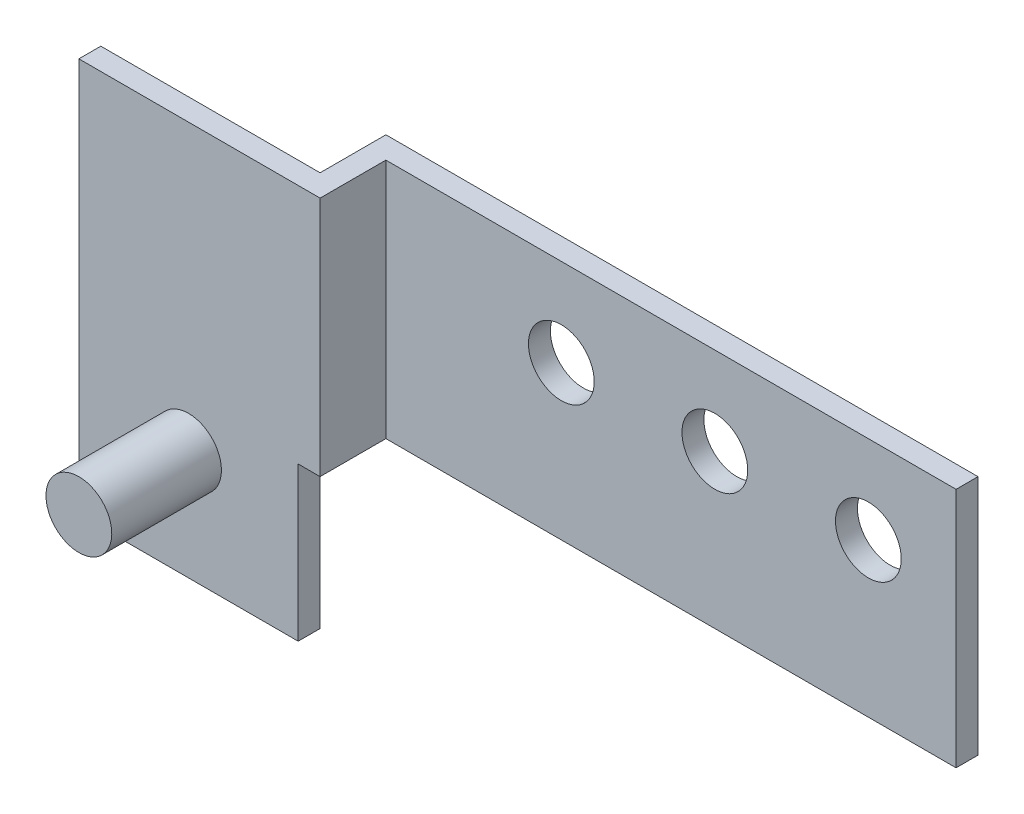
ISO-10303-21;
HEADER;
FILE_DESCRIPTION(('STEP AP214'),'2;1');
FILE_NAME('part.step','',(''),(''),'','','');
FILE_SCHEMA(('AUTOMOTIVE_DESIGN { 1 0 10303 214 1 1 1 1 }'));
ENDSEC;
DATA;
#1=APPLICATION_CONTEXT('core data for automotive mechanical design processes');
#2=APPLICATION_PROTOCOL_DEFINITION('international standard','automotive_design',2000,#1);
#3=PRODUCT_CONTEXT('',#1,'mechanical');
#4=PRODUCT('Part','Part','',(#3));
#5=PRODUCT_RELATED_PRODUCT_CATEGORY('part','',(#4));
#6=PRODUCT_DEFINITION_FORMATION('','',#4);
#7=PRODUCT_DEFINITION_CONTEXT('part definition',#1,'design');
#8=PRODUCT_DEFINITION('design','',#6,#7);
#9=PRODUCT_DEFINITION_SHAPE('','',#8);
#10=(LENGTH_UNIT() NAMED_UNIT(*) SI_UNIT(.MILLI.,.METRE.));
#11=(NAMED_UNIT(*) PLANE_ANGLE_UNIT() SI_UNIT($,.RADIAN.));
#12=(NAMED_UNIT(*) SI_UNIT($,.STERADIAN.) SOLID_ANGLE_UNIT());
#13=UNCERTAINTY_MEASURE_WITH_UNIT(LENGTH_MEASURE(1.E-05),#10,'distance_accuracy_value','');
#14=(GEOMETRIC_REPRESENTATION_CONTEXT(3) GLOBAL_UNCERTAINTY_ASSIGNED_CONTEXT((#13)) GLOBAL_UNIT_ASSIGNED_CONTEXT((#10,
#11,#12)) REPRESENTATION_CONTEXT('',''));
#15=CARTESIAN_POINT('',(0.,0.,0.));
#16=DIRECTION('',(0.,0.,1.));
#17=DIRECTION('',(1.,0.,0.));
#18=AXIS2_PLACEMENT_3D('',#15,#16,#17);
#19=CARTESIAN_POINT('',(0.,0.,3.));
#20=DIRECTION('',(0.,0.,1.));
#21=DIRECTION('',(1.,0.,0.));
#22=AXIS2_PLACEMENT_3D('',#19,#20,#21);
#23=PLANE('',#22);
#24=DIRECTION('',(0.,1.,0.));
#25=VECTOR('',#24,1.);
#26=CARTESIAN_POINT('',(0.,0.,3.));
#27=LINE('',#26,#25);
#28=CARTESIAN_POINT('',(0.,-11.,3.));
#29=VERTEX_POINT('',#28);
#30=CARTESIAN_POINT('',(0.,0.,3.));
#31=VERTEX_POINT('',#30);
#32=EDGE_CURVE('E108',#29,#31,#27,.T.);
#33=ORIENTED_EDGE('',*,*,#32,.F.);
#34=DIRECTION('',(0.,-1.,0.));
#35=VECTOR('',#34,1.);
#36=CARTESIAN_POINT('',(0.,-11.,3.));
#37=LINE('',#36,#35);
#38=CARTESIAN_POINT('',(0.,-18.,3.));
#39=VERTEX_POINT('',#38);
#40=EDGE_CURVE('E124',#29,#39,#37,.T.);
#41=ORIENTED_EDGE('',*,*,#40,.T.);
#42=DIRECTION('',(1.,0.,0.));
#43=VECTOR('',#42,1.);
#44=CARTESIAN_POINT('',(-10.,-18.,3.));
#45=LINE('',#44,#43);
#46=CARTESIAN_POINT('',(-10.,-18.,3.));
#47=VERTEX_POINT('',#46);
#48=EDGE_CURVE('E107',#47,#39,#45,.T.);
#49=ORIENTED_EDGE('',*,*,#48,.F.);
#50=DIRECTION('',(0.,-1.,0.));
#51=VECTOR('',#50,1.);
#52=CARTESIAN_POINT('',(-10.,0.,3.));
#53=LINE('',#52,#51);
#54=CARTESIAN_POINT('',(-10.,0.,3.));
#55=VERTEX_POINT('',#54);
#56=EDGE_CURVE('E81',#55,#47,#53,.T.);
#57=ORIENTED_EDGE('',*,*,#56,.F.);
#58=DIRECTION('',(-1.,0.,0.));
#59=VECTOR('',#58,1.);
#60=CARTESIAN_POINT('',(27.,0.,3.));
#61=LINE('',#60,#59);
#62=EDGE_CURVE('E59',#31,#55,#61,.T.);
#63=ORIENTED_EDGE('',*,*,#62,.F.);
#64=EDGE_LOOP('',(#33,#41,#49,#57,#63));
#65=FACE_BOUND('',#64,.T.);
#66=ADVANCED_FACE('F35',(#65),#23,.F.);
#67=CARTESIAN_POINT('',(-10.,0.,3.));
#68=DIRECTION('',(-1.,0.,0.));
#69=DIRECTION('',(0.,0.,1.));
#70=AXIS2_PLACEMENT_3D('',#67,#68,#69);
#71=PLANE('',#70);
#72=DIRECTION('',(0.,-1.,0.));
#73=VECTOR('',#72,1.);
#74=CARTESIAN_POINT('',(-10.,0.,4.));
#75=LINE('',#74,#73);
#76=CARTESIAN_POINT('',(-10.,0.,4.));
#77=VERTEX_POINT('',#76);
#78=CARTESIAN_POINT('',(-10.,-18.,4.));
#79=VERTEX_POINT('',#78);
#80=EDGE_CURVE('E77',#77,#79,#75,.T.);
#81=ORIENTED_EDGE('',*,*,#80,.F.);
#82=DIRECTION('',(0.,0.,1.));
#83=VECTOR('',#82,1.);
#84=CARTESIAN_POINT('',(-10.,0.,3.));
#85=LINE('',#84,#83);
#86=EDGE_CURVE('E43',#55,#77,#85,.T.);
#87=ORIENTED_EDGE('',*,*,#86,.F.);
#88=ORIENTED_EDGE('',*,*,#56,.T.);
#89=DIRECTION('',(0.,0.,1.));
#90=VECTOR('',#89,1.);
#91=CARTESIAN_POINT('',(-10.,-18.,3.));
#92=LINE('',#91,#90);
#93=EDGE_CURVE('E91',#47,#79,#92,.T.);
#94=ORIENTED_EDGE('',*,*,#93,.T.);
#95=EDGE_LOOP('',(#81,#87,#88,#94));
#96=FACE_BOUND('',#95,.T.);
#97=ADVANCED_FACE('F37',(#96),#71,.T.);
#98=CARTESIAN_POINT('',(27.,0.,3.));
#99=DIRECTION('',(0.,1.,0.));
#100=DIRECTION('',(-1.,0.,0.));
#101=AXIS2_PLACEMENT_3D('',#98,#99,#100);
#102=PLANE('',#101);
#103=DIRECTION('',(-1.,0.,0.));
#104=VECTOR('',#103,1.);
#105=CARTESIAN_POINT('',(27.,0.,1.));
#106=LINE('',#105,#104);
#107=CARTESIAN_POINT('',(27.,0.,1.));
#108=VERTEX_POINT('',#107);
#109=CARTESIAN_POINT('',(0.999999999999999,0.,1.));
#110=VERTEX_POINT('',#109);
#111=EDGE_CURVE('E113',#108,#110,#106,.T.);
#112=ORIENTED_EDGE('',*,*,#111,.F.);
#113=DIRECTION('',(0.,0.,1.));
#114=VECTOR('',#113,1.);
#115=CARTESIAN_POINT('',(27.,0.,3.));
#116=LINE('',#115,#114);
#117=CARTESIAN_POINT('',(27.,0.,0.));
#118=VERTEX_POINT('',#117);
#119=EDGE_CURVE('E89',#118,#108,#116,.T.);
#120=ORIENTED_EDGE('',*,*,#119,.F.);
#121=DIRECTION('',(1.,0.,0.));
#122=VECTOR('',#121,1.);
#123=CARTESIAN_POINT('',(27.,0.,0.));
#124=LINE('',#123,#122);
#125=CARTESIAN_POINT('',(0.,0.,0.));
#126=VERTEX_POINT('',#125);
#127=EDGE_CURVE('E207',#126,#118,#124,.T.);
#128=ORIENTED_EDGE('',*,*,#127,.F.);
#129=DIRECTION('',(0.,0.,1.));
#130=VECTOR('',#129,1.);
#131=CARTESIAN_POINT('',(0.,0.,0.));
#132=LINE('',#131,#130);
#133=EDGE_CURVE('E114',#126,#31,#132,.T.);
#134=ORIENTED_EDGE('',*,*,#133,.T.);
#135=ORIENTED_EDGE('',*,*,#62,.T.);
#136=ORIENTED_EDGE('',*,*,#86,.T.);
#137=DIRECTION('',(-1.,0.,0.));
#138=VECTOR('',#137,1.);
#139=CARTESIAN_POINT('',(27.,0.,4.));
#140=LINE('',#139,#138);
#141=CARTESIAN_POINT('',(0.999999999999998,0.,4.));
#142=VERTEX_POINT('',#141);
#143=EDGE_CURVE('E73',#142,#77,#140,.T.);
#144=ORIENTED_EDGE('',*,*,#143,.F.);
#145=DIRECTION('',(0.,0.,1.));
#146=VECTOR('',#145,1.);
#147=CARTESIAN_POINT('',(0.999999999999997,0.,2.99999999999999));
#148=LINE('',#147,#146);
#149=EDGE_CURVE('E198',#110,#142,#148,.T.);
#150=ORIENTED_EDGE('',*,*,#149,.F.);
#151=EDGE_LOOP('',(#112,#120,#128,#134,#135,#136,#144,#150));
#152=FACE_BOUND('',#151,.T.);
#153=ADVANCED_FACE('F85',(#152),#102,.T.);
#154=CARTESIAN_POINT('',(27.,-18.,3.));
#155=DIRECTION('',(1.,0.,0.));
#156=DIRECTION('',(0.,0.,-1.));
#157=AXIS2_PLACEMENT_3D('',#154,#155,#156);
#158=PLANE('',#157);
#159=DIRECTION('',(0.,-1.,0.));
#160=VECTOR('',#159,1.);
#161=CARTESIAN_POINT('',(27.,5.00000000083767E-05,1.));
#162=LINE('',#161,#160);
#163=CARTESIAN_POINT('',(27.,-11.,1.));
#164=VERTEX_POINT('',#163);
#165=EDGE_CURVE('E195',#108,#164,#162,.T.);
#166=ORIENTED_EDGE('',*,*,#165,.T.);
#167=DIRECTION('',(0.,0.,1.));
#168=VECTOR('',#167,1.);
#169=CARTESIAN_POINT('',(27.,-11.,3.));
#170=LINE('',#169,#168);
#171=CARTESIAN_POINT('',(27.,-11.,0.));
#172=VERTEX_POINT('',#171);
#173=EDGE_CURVE('E127',#172,#164,#170,.T.);
#174=ORIENTED_EDGE('',*,*,#173,.F.);
#175=DIRECTION('',(0.,-1.,0.));
#176=VECTOR('',#175,1.);
#177=CARTESIAN_POINT('',(27.,-11.,0.));
#178=LINE('',#177,#176);
#179=EDGE_CURVE('E118',#118,#172,#178,.T.);
#180=ORIENTED_EDGE('',*,*,#179,.F.);
#181=ORIENTED_EDGE('',*,*,#119,.T.);
#182=EDGE_LOOP('',(#166,#174,#180,#181));
#183=FACE_BOUND('',#182,.T.);
#184=ADVANCED_FACE('F214',(#183),#158,.T.);
#185=CARTESIAN_POINT('',(-10.,-18.,3.));
#186=DIRECTION('',(0.,-1.,0.));
#187=DIRECTION('',(0.,0.,-1.));
#188=AXIS2_PLACEMENT_3D('',#185,#186,#187);
#189=PLANE('',#188);
#190=DIRECTION('',(0.,0.,1.));
#191=VECTOR('',#190,1.);
#192=CARTESIAN_POINT('',(0.,-18.,3.));
#193=LINE('',#192,#191);
#194=CARTESIAN_POINT('',(0.,-18.,4.));
#195=VERTEX_POINT('',#194);
#196=EDGE_CURVE('E93',#39,#195,#193,.T.);
#197=ORIENTED_EDGE('',*,*,#196,.T.);
#198=DIRECTION('',(1.,0.,0.));
#199=VECTOR('',#198,1.);
#200=CARTESIAN_POINT('',(-10.,-18.,4.));
#201=LINE('',#200,#199);
#202=EDGE_CURVE('E82',#79,#195,#201,.T.);
#203=ORIENTED_EDGE('',*,*,#202,.F.);
#204=ORIENTED_EDGE('',*,*,#93,.F.);
#205=ORIENTED_EDGE('',*,*,#48,.T.);
#206=EDGE_LOOP('',(#197,#203,#204,#205));
#207=FACE_BOUND('',#206,.T.);
#208=ADVANCED_FACE('F140',(#207),#189,.T.);
#209=CARTESIAN_POINT('',(0.,0.,4.));
#210=DIRECTION('',(0.,0.,1.));
#211=DIRECTION('',(1.,0.,0.));
#212=AXIS2_PLACEMENT_3D('',#209,#210,#211);
#213=PLANE('',#212);
#214=CARTESIAN_POINT('',(-5.,-13.,4.));
#215=DIRECTION('',(0.,0.,1.));
#216=DIRECTION('',(1.,0.,0.));
#217=AXIS2_PLACEMENT_3D('',#214,#215,#216);
#218=CIRCLE('',#217,1.5);
#219=CARTESIAN_POINT('',(-3.5,-13.,4.));
#220=VERTEX_POINT('',#219);
#221=EDGE_CURVE('E11',#220,#220,#218,.T.);
#222=ORIENTED_EDGE('',*,*,#221,.F.);
#223=EDGE_LOOP('',(#222));
#224=FACE_BOUND('',#223,.T.);
#225=DIRECTION('',(0.,-1.,0.));
#226=VECTOR('',#225,1.);
#227=CARTESIAN_POINT('',(0.999999999999998,5.00000000049072E-05,4.));
#228=LINE('',#227,#226);
#229=CARTESIAN_POINT('',(0.999999999999997,-11.,4.));
#230=VERTEX_POINT('',#229);
#231=EDGE_CURVE('E50',#142,#230,#228,.T.);
#232=ORIENTED_EDGE('',*,*,#231,.F.);
#233=ORIENTED_EDGE('',*,*,#143,.T.);
#234=ORIENTED_EDGE('',*,*,#80,.T.);
#235=ORIENTED_EDGE('',*,*,#202,.T.);
#236=DIRECTION('',(0.,-1.,0.));
#237=VECTOR('',#236,1.);
#238=CARTESIAN_POINT('',(0.,-11.,4.));
#239=LINE('',#238,#237);
#240=CARTESIAN_POINT('',(0.,-11.,4.));
#241=VERTEX_POINT('',#240);
#242=EDGE_CURVE('E128',#241,#195,#239,.T.);
#243=ORIENTED_EDGE('',*,*,#242,.F.);
#244=DIRECTION('',(-1.,0.,0.));
#245=VECTOR('',#244,1.);
#246=CARTESIAN_POINT('',(27.,-11.,4.));
#247=LINE('',#246,#245);
#248=EDGE_CURVE('E123',#230,#241,#247,.T.);
#249=ORIENTED_EDGE('',*,*,#248,.F.);
#250=EDGE_LOOP('',(#232,#233,#234,#235,#243,#249));
#251=FACE_BOUND('',#250,.T.);
#252=ADVANCED_FACE('F74',(#224,#251),#213,.T.);
#253=CARTESIAN_POINT('',(0.,-11.,3.));
#254=DIRECTION('',(-1.,0.,0.));
#255=DIRECTION('',(0.,0.,1.));
#256=AXIS2_PLACEMENT_3D('',#253,#254,#255);
#257=PLANE('',#256);
#258=ORIENTED_EDGE('',*,*,#242,.T.);
#259=ORIENTED_EDGE('',*,*,#196,.F.);
#260=ORIENTED_EDGE('',*,*,#40,.F.);
#261=DIRECTION('',(0.,0.,1.));
#262=VECTOR('',#261,1.);
#263=CARTESIAN_POINT('',(0.,-11.,3.));
#264=LINE('',#263,#262);
#265=EDGE_CURVE('E97',#29,#241,#264,.T.);
#266=ORIENTED_EDGE('',*,*,#265,.T.);
#267=EDGE_LOOP('',(#258,#259,#260,#266));
#268=FACE_BOUND('',#267,.T.);
#269=ADVANCED_FACE('F150',(#268),#257,.F.);
#270=CARTESIAN_POINT('',(27.,-11.,3.));
#271=DIRECTION('',(0.,1.,0.));
#272=DIRECTION('',(-1.,0.,0.));
#273=AXIS2_PLACEMENT_3D('',#270,#271,#272);
#274=PLANE('',#273);
#275=ORIENTED_EDGE('',*,*,#173,.T.);
#276=DIRECTION('',(1.,0.,0.));
#277=VECTOR('',#276,1.);
#278=CARTESIAN_POINT('',(1.,-11.,1.));
#279=LINE('',#278,#277);
#280=CARTESIAN_POINT('',(1.,-11.,1.));
#281=VERTEX_POINT('',#280);
#282=EDGE_CURVE('E185',#281,#164,#279,.T.);
#283=ORIENTED_EDGE('',*,*,#282,.F.);
#284=DIRECTION('',(0.,0.,-1.));
#285=VECTOR('',#284,1.);
#286=CARTESIAN_POINT('',(1.,-11.,4.));
#287=LINE('',#286,#285);
#288=EDGE_CURVE('E182',#230,#281,#287,.T.);
#289=ORIENTED_EDGE('',*,*,#288,.F.);
#290=ORIENTED_EDGE('',*,*,#248,.T.);
#291=ORIENTED_EDGE('',*,*,#265,.F.);
#292=DIRECTION('',(0.,0.,1.));
#293=VECTOR('',#292,1.);
#294=CARTESIAN_POINT('',(0.,-11.,0.));
#295=LINE('',#294,#293);
#296=CARTESIAN_POINT('',(0.,-11.,0.));
#297=VERTEX_POINT('',#296);
#298=EDGE_CURVE('E120',#297,#29,#295,.T.);
#299=ORIENTED_EDGE('',*,*,#298,.F.);
#300=DIRECTION('',(-1.,0.,0.));
#301=VECTOR('',#300,1.);
#302=CARTESIAN_POINT('',(0.,-11.,0.));
#303=LINE('',#302,#301);
#304=EDGE_CURVE('E112',#172,#297,#303,.T.);
#305=ORIENTED_EDGE('',*,*,#304,.F.);
#306=EDGE_LOOP('',(#275,#283,#289,#290,#291,#299,#305));
#307=FACE_BOUND('',#306,.T.);
#308=ADVANCED_FACE('F166',(#307),#274,.F.);
#309=CARTESIAN_POINT('',(0.,0.,0.));
#310=DIRECTION('',(1.,0.,0.));
#311=DIRECTION('',(0.,0.,-1.));
#312=AXIS2_PLACEMENT_3D('',#309,#310,#311);
#313=PLANE('',#312);
#314=ORIENTED_EDGE('',*,*,#32,.T.);
#315=ORIENTED_EDGE('',*,*,#133,.F.);
#316=DIRECTION('',(0.,1.,0.));
#317=VECTOR('',#316,1.);
#318=CARTESIAN_POINT('',(0.,0.,0.));
#319=LINE('',#318,#317);
#320=EDGE_CURVE('E162',#297,#126,#319,.T.);
#321=ORIENTED_EDGE('',*,*,#320,.F.);
#322=ORIENTED_EDGE('',*,*,#298,.T.);
#323=EDGE_LOOP('',(#314,#315,#321,#322));
#324=FACE_BOUND('',#323,.T.);
#325=ADVANCED_FACE('F157',(#324),#313,.F.);
#326=CARTESIAN_POINT('',(0.,0.,0.));
#327=DIRECTION('',(0.,0.,1.));
#328=DIRECTION('',(1.,0.,0.));
#329=AXIS2_PLACEMENT_3D('',#326,#327,#328);
#330=PLANE('',#329);
#331=CARTESIAN_POINT('',(23.,-4.,0.));
#332=DIRECTION('',(0.,0.,1.));
#333=DIRECTION('',(1.,0.,0.));
#334=AXIS2_PLACEMENT_3D('',#331,#332,#333);
#335=CIRCLE('',#334,1.49999999999999);
#336=CARTESIAN_POINT('',(24.5,-4.,0.));
#337=VERTEX_POINT('',#336);
#338=EDGE_CURVE('E351',#337,#337,#335,.T.);
#339=ORIENTED_EDGE('',*,*,#338,.T.);
#340=EDGE_LOOP('',(#339));
#341=FACE_BOUND('',#340,.T.);
#342=CARTESIAN_POINT('',(16.,-4.,0.));
#343=DIRECTION('',(0.,0.,1.));
#344=DIRECTION('',(1.,0.,0.));
#345=AXIS2_PLACEMENT_3D('',#342,#343,#344);
#346=CIRCLE('',#345,1.49999999999999);
#347=CARTESIAN_POINT('',(17.5,-4.,0.));
#348=VERTEX_POINT('',#347);
#349=EDGE_CURVE('E355',#348,#348,#346,.T.);
#350=ORIENTED_EDGE('',*,*,#349,.T.);
#351=EDGE_LOOP('',(#350));
#352=FACE_BOUND('',#351,.T.);
#353=CARTESIAN_POINT('',(9.,-4.,0.));
#354=DIRECTION('',(0.,0.,1.));
#355=DIRECTION('',(1.,0.,0.));
#356=AXIS2_PLACEMENT_3D('',#353,#354,#355);
#357=CIRCLE('',#356,1.49999999999999);
#358=CARTESIAN_POINT('',(10.5,-4.,0.));
#359=VERTEX_POINT('',#358);
#360=EDGE_CURVE('E191',#359,#359,#357,.T.);
#361=ORIENTED_EDGE('',*,*,#360,.T.);
#362=EDGE_LOOP('',(#361));
#363=FACE_BOUND('',#362,.T.);
#364=ORIENTED_EDGE('',*,*,#304,.T.);
#365=ORIENTED_EDGE('',*,*,#320,.T.);
#366=ORIENTED_EDGE('',*,*,#127,.T.);
#367=ORIENTED_EDGE('',*,*,#179,.T.);
#368=EDGE_LOOP('',(#364,#365,#366,#367));
#369=FACE_BOUND('',#368,.T.);
#370=ADVANCED_FACE('F234',(#341,#352,#363,#369),#330,.F.);
#371=CARTESIAN_POINT('',(0.999999999999999,5.00000000049072E-05,1.));
#372=DIRECTION('',(0.,0.,-1.));
#373=DIRECTION('',(-1.,0.,0.));
#374=AXIS2_PLACEMENT_3D('',#371,#372,#373);
#375=PLANE('',#374);
#376=CARTESIAN_POINT('',(23.,-4.,1.));
#377=DIRECTION('',(0.,0.,1.));
#378=DIRECTION('',(1.,0.,0.));
#379=AXIS2_PLACEMENT_3D('',#376,#377,#378);
#380=CIRCLE('',#379,1.49999999999999);
#381=CARTESIAN_POINT('',(24.5,-4.,1.));
#382=VERTEX_POINT('',#381);
#383=EDGE_CURVE('E348',#382,#382,#380,.T.);
#384=ORIENTED_EDGE('',*,*,#383,.F.);
#385=EDGE_LOOP('',(#384));
#386=FACE_BOUND('',#385,.T.);
#387=CARTESIAN_POINT('',(16.,-4.,1.));
#388=DIRECTION('',(0.,0.,1.));
#389=DIRECTION('',(1.,0.,0.));
#390=AXIS2_PLACEMENT_3D('',#387,#388,#389);
#391=CIRCLE('',#390,1.49999999999999);
#392=CARTESIAN_POINT('',(17.5,-4.,1.));
#393=VERTEX_POINT('',#392);
#394=EDGE_CURVE('E352',#393,#393,#391,.T.);
#395=ORIENTED_EDGE('',*,*,#394,.F.);
#396=EDGE_LOOP('',(#395));
#397=FACE_BOUND('',#396,.T.);
#398=CARTESIAN_POINT('',(9.,-4.,1.));
#399=DIRECTION('',(0.,0.,1.));
#400=DIRECTION('',(1.,0.,0.));
#401=AXIS2_PLACEMENT_3D('',#398,#399,#400);
#402=CIRCLE('',#401,1.49999999999999);
#403=CARTESIAN_POINT('',(10.5,-4.,1.));
#404=VERTEX_POINT('',#403);
#405=EDGE_CURVE('E361',#404,#404,#402,.T.);
#406=ORIENTED_EDGE('',*,*,#405,.F.);
#407=EDGE_LOOP('',(#406));
#408=FACE_BOUND('',#407,.T.);
#409=ORIENTED_EDGE('',*,*,#111,.T.);
#410=DIRECTION('',(0.,-1.,0.));
#411=VECTOR('',#410,1.);
#412=CARTESIAN_POINT('',(0.999999999999999,5.00000000049072E-05,1.));
#413=LINE('',#412,#411);
#414=EDGE_CURVE('E199',#110,#281,#413,.T.);
#415=ORIENTED_EDGE('',*,*,#414,.T.);
#416=ORIENTED_EDGE('',*,*,#282,.T.);
#417=ORIENTED_EDGE('',*,*,#165,.F.);
#418=EDGE_LOOP('',(#409,#415,#416,#417));
#419=FACE_BOUND('',#418,.T.);
#420=ADVANCED_FACE('F222',(#386,#397,#408,#419),#375,.F.);
#421=CARTESIAN_POINT('',(0.999999999999998,5.00000000049072E-05,4.));
#422=DIRECTION('',(-1.,0.,0.));
#423=DIRECTION('',(0.,0.,1.));
#424=AXIS2_PLACEMENT_3D('',#421,#422,#423);
#425=PLANE('',#424);
#426=ORIENTED_EDGE('',*,*,#149,.T.);
#427=ORIENTED_EDGE('',*,*,#231,.T.);
#428=ORIENTED_EDGE('',*,*,#288,.T.);
#429=ORIENTED_EDGE('',*,*,#414,.F.);
#430=EDGE_LOOP('',(#426,#427,#428,#429));
#431=FACE_BOUND('',#430,.T.);
#432=ADVANCED_FACE('F223',(#431),#425,.F.);
#433=CARTESIAN_POINT('',(-5.,-13.,9.));
#434=DIRECTION('',(0.,0.,-1.));
#435=DIRECTION('',(0.,1.,0.));
#436=AXIS2_PLACEMENT_3D('',#433,#434,#435);
#437=CYLINDRICAL_SURFACE('',#436,1.5);
#438=CARTESIAN_POINT('',(-5.,-13.,9.));
#439=DIRECTION('',(0.,0.,-1.));
#440=DIRECTION('',(0.,1.,0.));
#441=AXIS2_PLACEMENT_3D('',#438,#439,#440);
#442=CIRCLE('',#441,1.5);
#443=CARTESIAN_POINT('',(-5.,-11.5,9.));
#444=VERTEX_POINT('',#443);
#445=EDGE_CURVE('E187',#444,#444,#442,.T.);
#446=ORIENTED_EDGE('',*,*,#445,.T.);
#447=EDGE_LOOP('',(#446));
#448=FACE_BOUND('',#447,.T.);
#449=ORIENTED_EDGE('',*,*,#221,.T.);
#450=EDGE_LOOP('',(#449));
#451=FACE_BOUND('',#450,.T.);
#452=ADVANCED_FACE('F225',(#448,#451),#437,.T.);
#453=CARTESIAN_POINT('',(-3.5,-13.,9.));
#454=DIRECTION('',(0.,0.,1.));
#455=DIRECTION('',(0.,-1.,0.));
#456=AXIS2_PLACEMENT_3D('',#453,#454,#455);
#457=PLANE('',#456);
#458=ORIENTED_EDGE('',*,*,#445,.F.);
#459=EDGE_LOOP('',(#458));
#460=FACE_BOUND('',#459,.T.);
#461=ADVANCED_FACE('F231',(#460),#457,.T.);
#462=CARTESIAN_POINT('',(9.,-4.,1.));
#463=DIRECTION('',(0.,0.,1.));
#464=DIRECTION('',(1.,0.,0.));
#465=AXIS2_PLACEMENT_3D('',#462,#463,#464);
#466=CYLINDRICAL_SURFACE('',#465,1.49999999999999);
#467=ORIENTED_EDGE('',*,*,#405,.T.);
#468=EDGE_LOOP('',(#467));
#469=FACE_BOUND('',#468,.T.);
#470=ORIENTED_EDGE('',*,*,#360,.F.);
#471=EDGE_LOOP('',(#470));
#472=FACE_BOUND('',#471,.T.);
#473=ADVANCED_FACE('F297',(#469,#472),#466,.F.);
#474=CARTESIAN_POINT('',(16.,-4.,1.));
#475=DIRECTION('',(0.,0.,1.));
#476=DIRECTION('',(1.,0.,0.));
#477=AXIS2_PLACEMENT_3D('',#474,#475,#476);
#478=CYLINDRICAL_SURFACE('',#477,1.49999999999999);
#479=ORIENTED_EDGE('',*,*,#394,.T.);
#480=EDGE_LOOP('',(#479));
#481=FACE_BOUND('',#480,.T.);
#482=ORIENTED_EDGE('',*,*,#349,.F.);
#483=EDGE_LOOP('',(#482));
#484=FACE_BOUND('',#483,.T.);
#485=ADVANCED_FACE('F302',(#481,#484),#478,.F.);
#486=CARTESIAN_POINT('',(23.,-4.,1.));
#487=DIRECTION('',(0.,0.,1.));
#488=DIRECTION('',(1.,0.,0.));
#489=AXIS2_PLACEMENT_3D('',#486,#487,#488);
#490=CYLINDRICAL_SURFACE('',#489,1.49999999999999);
#491=ORIENTED_EDGE('',*,*,#383,.T.);
#492=EDGE_LOOP('',(#491));
#493=FACE_BOUND('',#492,.T.);
#494=ORIENTED_EDGE('',*,*,#338,.F.);
#495=EDGE_LOOP('',(#494));
#496=FACE_BOUND('',#495,.T.);
#497=ADVANCED_FACE('F314',(#493,#496),#490,.F.);
#498=CLOSED_SHELL('',(#66,#97,#153,#184,#208,#252,#269,#308,#325,#370,#420,#432,#452,#461,#473,
#485,#497));
#499=MANIFOLD_SOLID_BREP('B2',#498);
#500=ADVANCED_BREP_SHAPE_REPRESENTATION('',(#18,#499),#14);
#501=SHAPE_DEFINITION_REPRESENTATION(#9,#500);
ENDSEC;
END-ISO-10303-21;
